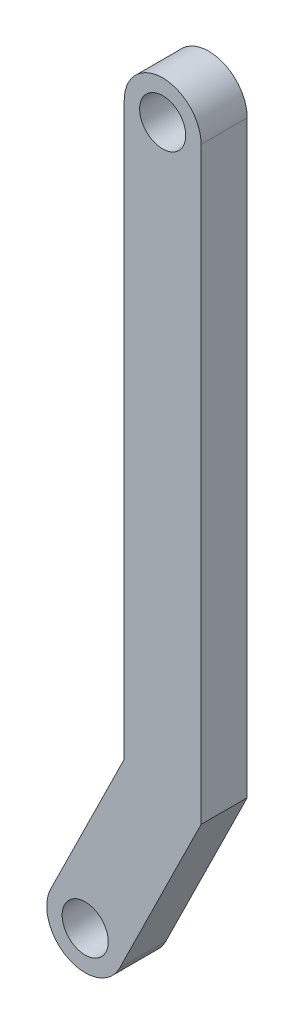
ISO-10303-21;
HEADER;
FILE_DESCRIPTION(('STEP AP214'),'2;1');
FILE_NAME('part.step','',(''),(''),'','','');
FILE_SCHEMA(('AUTOMOTIVE_DESIGN { 1 0 10303 214 1 1 1 1 }'));
ENDSEC;
DATA;
#1=APPLICATION_CONTEXT('core data for automotive mechanical design processes');
#2=APPLICATION_PROTOCOL_DEFINITION('international standard','automotive_design',2000,#1);
#3=PRODUCT_CONTEXT('',#1,'mechanical');
#4=PRODUCT('Part','Part','',(#3));
#5=PRODUCT_RELATED_PRODUCT_CATEGORY('part','',(#4));
#6=PRODUCT_DEFINITION_FORMATION('','',#4);
#7=PRODUCT_DEFINITION_CONTEXT('part definition',#1,'design');
#8=PRODUCT_DEFINITION('design','',#6,#7);
#9=PRODUCT_DEFINITION_SHAPE('','',#8);
#10=(LENGTH_UNIT() NAMED_UNIT(*) SI_UNIT(.MILLI.,.METRE.));
#11=(NAMED_UNIT(*) PLANE_ANGLE_UNIT() SI_UNIT($,.RADIAN.));
#12=(NAMED_UNIT(*) SI_UNIT($,.STERADIAN.) SOLID_ANGLE_UNIT());
#13=UNCERTAINTY_MEASURE_WITH_UNIT(LENGTH_MEASURE(1.E-05),#10,'distance_accuracy_value','');
#14=(GEOMETRIC_REPRESENTATION_CONTEXT(3) GLOBAL_UNCERTAINTY_ASSIGNED_CONTEXT((#13)) GLOBAL_UNIT_ASSIGNED_CONTEXT((#10,
#11,#12)) REPRESENTATION_CONTEXT('',''));
#15=CARTESIAN_POINT('',(0.,0.,0.));
#16=DIRECTION('',(0.,0.,1.));
#17=DIRECTION('',(1.,0.,0.));
#18=AXIS2_PLACEMENT_3D('',#15,#16,#17);
#19=CARTESIAN_POINT('',(-36.0540660085619,459.688422396605,30.));
#20=DIRECTION('',(0.,0.,-1.));
#21=DIRECTION('',(-1.,0.,0.));
#22=AXIS2_PLACEMENT_3D('',#19,#20,#21);
#23=PLANE('',#22);
#24=CARTESIAN_POINT('',(-36.0540660085619,459.688422396605,30.));
#25=DIRECTION('',(0.,0.,1.));
#26=DIRECTION('',(-1.,0.,0.));
#27=AXIS2_PLACEMENT_3D('',#24,#25,#26);
#28=CIRCLE('',#27,25.);
#29=CARTESIAN_POINT('',(-11.0540660085619,459.688422396605,30.));
#30=VERTEX_POINT('',#29);
#31=CARTESIAN_POINT('',(-61.0540660085619,459.688422396605,30.));
#32=VERTEX_POINT('',#31);
#33=EDGE_CURVE('E133',#30,#32,#28,.T.);
#34=ORIENTED_EDGE('',*,*,#33,.T.);
#35=DIRECTION('',(0.,-1.,0.));
#36=VECTOR('',#35,1.);
#37=CARTESIAN_POINT('',(-61.0540660085619,459.688422396605,30.));
#38=LINE('',#37,#36);
#39=CARTESIAN_POINT('',(-61.0540660085619,88.3199051446063,30.));
#40=VERTEX_POINT('',#39);
#41=EDGE_CURVE('E91',#32,#40,#38,.T.);
#42=ORIENTED_EDGE('',*,*,#41,.T.);
#43=DIRECTION('',(-0.442445217304877,-0.89679553393404,0.));
#44=VECTOR('',#43,1.);
#45=CARTESIAN_POINT('',(-61.0540660085619,88.3199051446063,30.));
#46=LINE('',#45,#44);
#47=CARTESIAN_POINT('',(-108.868464607938,-8.5954584858601,30.));
#48=VERTEX_POINT('',#47);
#49=EDGE_CURVE('E104',#40,#48,#46,.T.);
#50=ORIENTED_EDGE('',*,*,#49,.T.);
#51=CARTESIAN_POINT('',(-86.4485762595873,-19.656588918482,30.));
#52=DIRECTION('',(0.,0.,1.));
#53=DIRECTION('',(1.,0.,0.));
#54=AXIS2_PLACEMENT_3D('',#51,#52,#53);
#55=CIRCLE('',#54,25.);
#56=CARTESIAN_POINT('',(-64.0286879112363,-30.7177193511039,30.));
#57=VERTEX_POINT('',#56);
#58=EDGE_CURVE('E98',#48,#57,#55,.T.);
#59=ORIENTED_EDGE('',*,*,#58,.T.);
#60=DIRECTION('',(0.442445217304877,0.89679553393404,0.));
#61=VECTOR('',#60,1.);
#62=CARTESIAN_POINT('',(-11.0540660085619,76.6569396486041,30.));
#63=LINE('',#62,#61);
#64=CARTESIAN_POINT('',(-11.0540660085619,76.6569396486041,30.));
#65=VERTEX_POINT('',#64);
#66=EDGE_CURVE('E102',#57,#65,#63,.T.);
#67=ORIENTED_EDGE('',*,*,#66,.T.);
#68=DIRECTION('',(0.,1.,0.));
#69=VECTOR('',#68,1.);
#70=CARTESIAN_POINT('',(-11.0540660085619,459.688422396605,30.));
#71=LINE('',#70,#69);
#72=EDGE_CURVE('E54',#65,#30,#71,.T.);
#73=ORIENTED_EDGE('',*,*,#72,.T.);
#74=EDGE_LOOP('',(#34,#42,#50,#59,#67,#73));
#75=FACE_BOUND('',#74,.T.);
#76=CARTESIAN_POINT('',(-36.0540660085619,459.688422396605,30.));
#77=DIRECTION('',(0.,0.,1.));
#78=DIRECTION('',(1.,0.,0.));
#79=AXIS2_PLACEMENT_3D('',#76,#77,#78);
#80=CIRCLE('',#79,15.);
#81=CARTESIAN_POINT('',(-21.0540660085619,459.688422396605,30.));
#82=VERTEX_POINT('',#81);
#83=EDGE_CURVE('E126',#82,#82,#80,.T.);
#84=ORIENTED_EDGE('',*,*,#83,.F.);
#85=EDGE_LOOP('',(#84));
#86=FACE_BOUND('',#85,.T.);
#87=CARTESIAN_POINT('',(-86.4485762595873,-19.656588918482,30.));
#88=DIRECTION('',(0.,0.,1.));
#89=DIRECTION('',(1.,0.,0.));
#90=AXIS2_PLACEMENT_3D('',#87,#88,#89);
#91=CIRCLE('',#90,15.);
#92=CARTESIAN_POINT('',(-71.4485762595873,-19.656588918482,30.));
#93=VERTEX_POINT('',#92);
#94=EDGE_CURVE('E174',#93,#93,#91,.T.);
#95=ORIENTED_EDGE('',*,*,#94,.F.);
#96=EDGE_LOOP('',(#95));
#97=FACE_BOUND('',#96,.T.);
#98=ADVANCED_FACE('F37',(#75,#86,#97),#23,.F.);
#99=CARTESIAN_POINT('',(-36.0540660085619,459.688422396605,0.));
#100=DIRECTION('',(0.,0.,-1.));
#101=DIRECTION('',(-1.,0.,0.));
#102=AXIS2_PLACEMENT_3D('',#99,#100,#101);
#103=PLANE('',#102);
#104=CARTESIAN_POINT('',(-36.0540660085619,459.688422396605,0.));
#105=DIRECTION('',(0.,0.,1.));
#106=DIRECTION('',(1.,0.,0.));
#107=AXIS2_PLACEMENT_3D('',#104,#105,#106);
#108=CIRCLE('',#107,15.);
#109=CARTESIAN_POINT('',(-21.0540660085619,459.688422396605,0.));
#110=VERTEX_POINT('',#109);
#111=EDGE_CURVE('E179',#110,#110,#108,.T.);
#112=ORIENTED_EDGE('',*,*,#111,.T.);
#113=EDGE_LOOP('',(#112));
#114=FACE_BOUND('',#113,.T.);
#115=CARTESIAN_POINT('',(-36.0540660085619,459.688422396605,0.));
#116=DIRECTION('',(0.,0.,1.));
#117=DIRECTION('',(-1.,0.,0.));
#118=AXIS2_PLACEMENT_3D('',#115,#116,#117);
#119=CIRCLE('',#118,25.);
#120=CARTESIAN_POINT('',(-11.0540660085619,459.688422396605,0.));
#121=VERTEX_POINT('',#120);
#122=CARTESIAN_POINT('',(-61.0540660085619,459.688422396605,0.));
#123=VERTEX_POINT('',#122);
#124=EDGE_CURVE('E122',#121,#123,#119,.T.);
#125=ORIENTED_EDGE('',*,*,#124,.F.);
#126=DIRECTION('',(0.,1.,0.));
#127=VECTOR('',#126,1.);
#128=CARTESIAN_POINT('',(-11.0540660085619,459.688422396605,0.));
#129=LINE('',#128,#127);
#130=CARTESIAN_POINT('',(-11.0540660085619,76.6569396486041,0.));
#131=VERTEX_POINT('',#130);
#132=EDGE_CURVE('E83',#131,#121,#129,.T.);
#133=ORIENTED_EDGE('',*,*,#132,.F.);
#134=DIRECTION('',(0.442445217304877,0.89679553393404,0.));
#135=VECTOR('',#134,1.);
#136=CARTESIAN_POINT('',(-11.0540660085619,76.6569396486041,0.));
#137=LINE('',#136,#135);
#138=CARTESIAN_POINT('',(-64.0286879112363,-30.7177193511039,0.));
#139=VERTEX_POINT('',#138);
#140=EDGE_CURVE('E77',#139,#131,#137,.T.);
#141=ORIENTED_EDGE('',*,*,#140,.F.);
#142=CARTESIAN_POINT('',(-86.4485762595873,-19.656588918482,0.));
#143=DIRECTION('',(0.,0.,1.));
#144=DIRECTION('',(1.,0.,0.));
#145=AXIS2_PLACEMENT_3D('',#142,#143,#144);
#146=CIRCLE('',#145,25.);
#147=CARTESIAN_POINT('',(-108.868464607938,-8.5954584858601,0.));
#148=VERTEX_POINT('',#147);
#149=EDGE_CURVE('E112',#148,#139,#146,.T.);
#150=ORIENTED_EDGE('',*,*,#149,.F.);
#151=DIRECTION('',(-0.442445217304877,-0.89679553393404,0.));
#152=VECTOR('',#151,1.);
#153=CARTESIAN_POINT('',(-61.0540660085619,88.3199051446063,0.));
#154=LINE('',#153,#152);
#155=CARTESIAN_POINT('',(-61.0540660085619,88.3199051446063,0.));
#156=VERTEX_POINT('',#155);
#157=EDGE_CURVE('E128',#156,#148,#154,.T.);
#158=ORIENTED_EDGE('',*,*,#157,.F.);
#159=DIRECTION('',(0.,-1.,0.));
#160=VECTOR('',#159,1.);
#161=CARTESIAN_POINT('',(-61.0540660085619,459.688422396605,0.));
#162=LINE('',#161,#160);
#163=EDGE_CURVE('E125',#123,#156,#162,.T.);
#164=ORIENTED_EDGE('',*,*,#163,.F.);
#165=EDGE_LOOP('',(#125,#133,#141,#150,#158,#164));
#166=FACE_BOUND('',#165,.T.);
#167=CARTESIAN_POINT('',(-86.4485762595873,-19.656588918482,0.));
#168=DIRECTION('',(0.,0.,1.));
#169=DIRECTION('',(1.,0.,0.));
#170=AXIS2_PLACEMENT_3D('',#167,#168,#169);
#171=CIRCLE('',#170,15.);
#172=CARTESIAN_POINT('',(-71.4485762595873,-19.656588918482,0.));
#173=VERTEX_POINT('',#172);
#174=EDGE_CURVE('E177',#173,#173,#171,.T.);
#175=ORIENTED_EDGE('',*,*,#174,.T.);
#176=EDGE_LOOP('',(#175));
#177=FACE_BOUND('',#176,.T.);
#178=ADVANCED_FACE('F142',(#114,#166,#177),#103,.T.);
#179=CARTESIAN_POINT('',(-36.0540660085619,459.688422396605,30.));
#180=DIRECTION('',(0.,0.,-1.));
#181=DIRECTION('',(-1.,0.,0.));
#182=AXIS2_PLACEMENT_3D('',#179,#180,#181);
#183=CYLINDRICAL_SURFACE('',#182,25.);
#184=ORIENTED_EDGE('',*,*,#124,.T.);
#185=DIRECTION('',(0.,0.,-1.));
#186=VECTOR('',#185,1.);
#187=CARTESIAN_POINT('',(-61.0540660085619,459.688422396605,30.));
#188=LINE('',#187,#186);
#189=EDGE_CURVE('E11',#32,#123,#188,.T.);
#190=ORIENTED_EDGE('',*,*,#189,.F.);
#191=ORIENTED_EDGE('',*,*,#33,.F.);
#192=DIRECTION('',(0.,0.,-1.));
#193=VECTOR('',#192,1.);
#194=CARTESIAN_POINT('',(-11.0540660085619,459.688422396605,30.));
#195=LINE('',#194,#193);
#196=EDGE_CURVE('E118',#30,#121,#195,.T.);
#197=ORIENTED_EDGE('',*,*,#196,.T.);
#198=EDGE_LOOP('',(#184,#190,#191,#197));
#199=FACE_BOUND('',#198,.T.);
#200=ADVANCED_FACE('F39',(#199),#183,.T.);
#201=CARTESIAN_POINT('',(-61.0540660085619,459.688422396605,30.));
#202=DIRECTION('',(1.,0.,0.));
#203=DIRECTION('',(0.,1.,0.));
#204=AXIS2_PLACEMENT_3D('',#201,#202,#203);
#205=PLANE('',#204);
#206=ORIENTED_EDGE('',*,*,#163,.T.);
#207=DIRECTION('',(0.,0.,-1.));
#208=VECTOR('',#207,1.);
#209=CARTESIAN_POINT('',(-61.0540660085619,88.3199051446063,30.));
#210=LINE('',#209,#208);
#211=EDGE_CURVE('E46',#40,#156,#210,.T.);
#212=ORIENTED_EDGE('',*,*,#211,.F.);
#213=ORIENTED_EDGE('',*,*,#41,.F.);
#214=ORIENTED_EDGE('',*,*,#189,.T.);
#215=EDGE_LOOP('',(#206,#212,#213,#214));
#216=FACE_BOUND('',#215,.T.);
#217=ADVANCED_FACE('F226',(#216),#205,.F.);
#218=CARTESIAN_POINT('',(-61.0540660085619,88.3199051446063,30.));
#219=DIRECTION('',(0.89679553393404,-0.442445217304877,0.));
#220=DIRECTION('',(0.442445217304877,0.89679553393404,0.));
#221=AXIS2_PLACEMENT_3D('',#218,#219,#220);
#222=PLANE('',#221);
#223=ORIENTED_EDGE('',*,*,#157,.T.);
#224=DIRECTION('',(0.,0.,-1.));
#225=VECTOR('',#224,1.);
#226=CARTESIAN_POINT('',(-108.868464607938,-8.5954584858601,30.));
#227=LINE('',#226,#225);
#228=EDGE_CURVE('E113',#48,#148,#227,.T.);
#229=ORIENTED_EDGE('',*,*,#228,.F.);
#230=ORIENTED_EDGE('',*,*,#49,.F.);
#231=ORIENTED_EDGE('',*,*,#211,.T.);
#232=EDGE_LOOP('',(#223,#229,#230,#231));
#233=FACE_BOUND('',#232,.T.);
#234=ADVANCED_FACE('F139',(#233),#222,.F.);
#235=CARTESIAN_POINT('',(-86.4485762595873,-19.656588918482,30.));
#236=DIRECTION('',(0.,0.,-1.));
#237=DIRECTION('',(-1.,0.,0.));
#238=AXIS2_PLACEMENT_3D('',#235,#236,#237);
#239=CYLINDRICAL_SURFACE('',#238,25.);
#240=ORIENTED_EDGE('',*,*,#149,.T.);
#241=DIRECTION('',(0.,0.,-1.));
#242=VECTOR('',#241,1.);
#243=CARTESIAN_POINT('',(-64.0286879112363,-30.7177193511039,30.));
#244=LINE('',#243,#242);
#245=EDGE_CURVE('E109',#57,#139,#244,.T.);
#246=ORIENTED_EDGE('',*,*,#245,.F.);
#247=ORIENTED_EDGE('',*,*,#58,.F.);
#248=ORIENTED_EDGE('',*,*,#228,.T.);
#249=EDGE_LOOP('',(#240,#246,#247,#248));
#250=FACE_BOUND('',#249,.T.);
#251=ADVANCED_FACE('F110',(#250),#239,.T.);
#252=CARTESIAN_POINT('',(-11.0540660085619,76.6569396486041,30.));
#253=DIRECTION('',(-0.89679553393404,0.442445217304877,0.));
#254=DIRECTION('',(-0.442445217304877,-0.896795533934041,0.));
#255=AXIS2_PLACEMENT_3D('',#252,#253,#254);
#256=PLANE('',#255);
#257=ORIENTED_EDGE('',*,*,#140,.T.);
#258=DIRECTION('',(0.,0.,-1.));
#259=VECTOR('',#258,1.);
#260=CARTESIAN_POINT('',(-11.0540660085619,76.6569396486041,30.));
#261=LINE('',#260,#259);
#262=EDGE_CURVE('E114',#65,#131,#261,.T.);
#263=ORIENTED_EDGE('',*,*,#262,.F.);
#264=ORIENTED_EDGE('',*,*,#66,.F.);
#265=ORIENTED_EDGE('',*,*,#245,.T.);
#266=EDGE_LOOP('',(#257,#263,#264,#265));
#267=FACE_BOUND('',#266,.T.);
#268=ADVANCED_FACE('F116',(#267),#256,.F.);
#269=CARTESIAN_POINT('',(-11.0540660085619,459.688422396605,30.));
#270=DIRECTION('',(-1.,0.,0.));
#271=DIRECTION('',(0.,-1.,0.));
#272=AXIS2_PLACEMENT_3D('',#269,#270,#271);
#273=PLANE('',#272);
#274=ORIENTED_EDGE('',*,*,#132,.T.);
#275=ORIENTED_EDGE('',*,*,#196,.F.);
#276=ORIENTED_EDGE('',*,*,#72,.F.);
#277=ORIENTED_EDGE('',*,*,#262,.T.);
#278=EDGE_LOOP('',(#274,#275,#276,#277));
#279=FACE_BOUND('',#278,.T.);
#280=ADVANCED_FACE('F147',(#279),#273,.F.);
#281=CARTESIAN_POINT('',(-36.0540660085619,459.688422396605,30.));
#282=DIRECTION('',(0.,0.,-1.));
#283=DIRECTION('',(-1.,0.,0.));
#284=AXIS2_PLACEMENT_3D('',#281,#282,#283);
#285=CYLINDRICAL_SURFACE('',#284,15.);
#286=ORIENTED_EDGE('',*,*,#83,.T.);
#287=EDGE_LOOP('',(#286));
#288=FACE_BOUND('',#287,.T.);
#289=ORIENTED_EDGE('',*,*,#111,.F.);
#290=EDGE_LOOP('',(#289));
#291=FACE_BOUND('',#290,.T.);
#292=ADVANCED_FACE('F149',(#288,#291),#285,.F.);
#293=CARTESIAN_POINT('',(-86.4485762595873,-19.656588918482,30.));
#294=DIRECTION('',(0.,0.,-1.));
#295=DIRECTION('',(-1.,0.,0.));
#296=AXIS2_PLACEMENT_3D('',#293,#294,#295);
#297=CYLINDRICAL_SURFACE('',#296,15.);
#298=ORIENTED_EDGE('',*,*,#94,.T.);
#299=EDGE_LOOP('',(#298));
#300=FACE_BOUND('',#299,.T.);
#301=ORIENTED_EDGE('',*,*,#174,.F.);
#302=EDGE_LOOP('',(#301));
#303=FACE_BOUND('',#302,.T.);
#304=ADVANCED_FACE('F155',(#300,#303),#297,.F.);
#305=CLOSED_SHELL('',(#98,#178,#200,#217,#234,#251,#268,#280,#292,#304));
#306=MANIFOLD_SOLID_BREP('B2',#305);
#307=ADVANCED_BREP_SHAPE_REPRESENTATION('',(#18,#306),#14);
#308=SHAPE_DEFINITION_REPRESENTATION(#9,#307);
ENDSEC;
END-ISO-10303-21;
